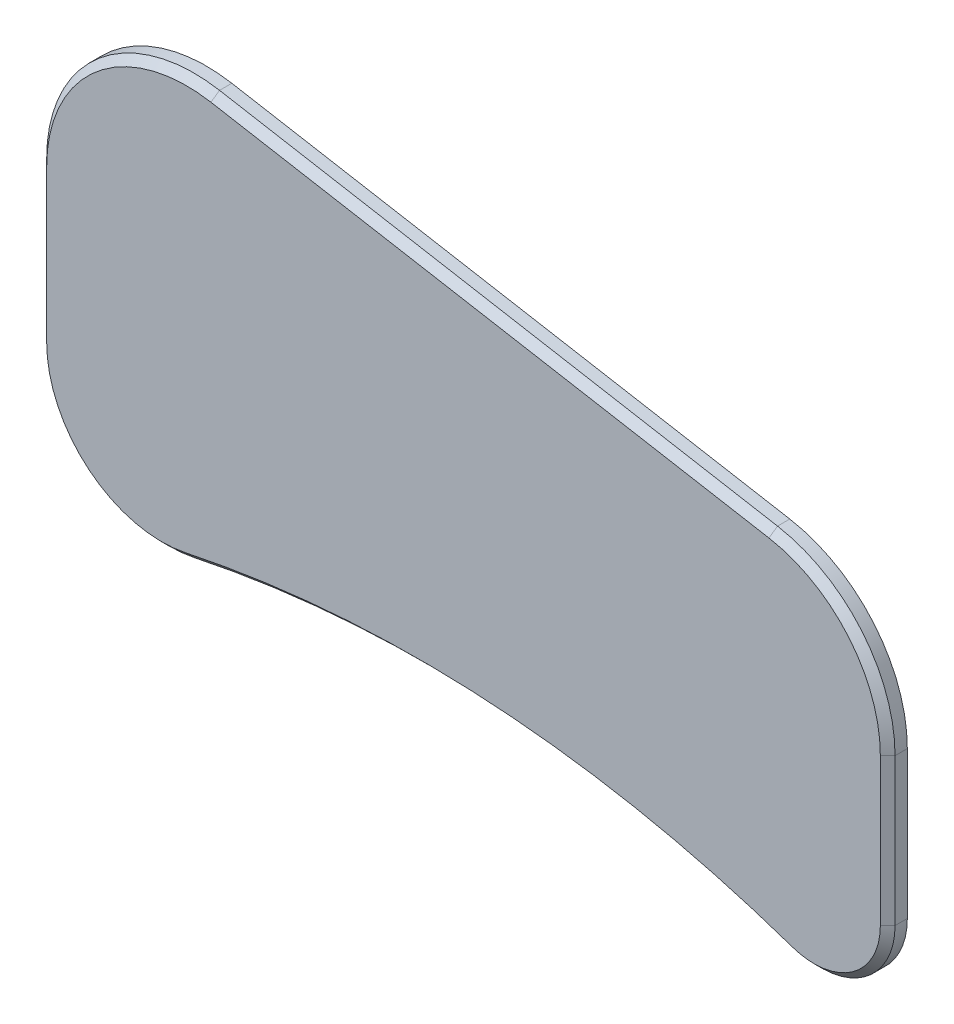
ISO-10303-21;
HEADER;
FILE_DESCRIPTION(('STEP AP214'),'2;1');
FILE_NAME('part.step','',(''),(''),'','','');
FILE_SCHEMA(('AUTOMOTIVE_DESIGN { 1 0 10303 214 1 1 1 1 }'));
ENDSEC;
DATA;
#1=APPLICATION_CONTEXT('core data for automotive mechanical design processes');
#2=APPLICATION_PROTOCOL_DEFINITION('international standard','automotive_design',2000,#1);
#3=PRODUCT_CONTEXT('',#1,'mechanical');
#4=PRODUCT('Part','Part','',(#3));
#5=PRODUCT_RELATED_PRODUCT_CATEGORY('part','',(#4));
#6=PRODUCT_DEFINITION_FORMATION('','',#4);
#7=PRODUCT_DEFINITION_CONTEXT('part definition',#1,'design');
#8=PRODUCT_DEFINITION('design','',#6,#7);
#9=PRODUCT_DEFINITION_SHAPE('','',#8);
#10=(LENGTH_UNIT() NAMED_UNIT(*) SI_UNIT(.MILLI.,.METRE.));
#11=(NAMED_UNIT(*) PLANE_ANGLE_UNIT() SI_UNIT($,.RADIAN.));
#12=(NAMED_UNIT(*) SI_UNIT($,.STERADIAN.) SOLID_ANGLE_UNIT());
#13=UNCERTAINTY_MEASURE_WITH_UNIT(LENGTH_MEASURE(1.E-05),#10,'distance_accuracy_value','');
#14=(GEOMETRIC_REPRESENTATION_CONTEXT(3) GLOBAL_UNCERTAINTY_ASSIGNED_CONTEXT((#13)) GLOBAL_UNIT_ASSIGNED_CONTEXT((#10,
#11,#12)) REPRESENTATION_CONTEXT('',''));
#15=CARTESIAN_POINT('',(0.,0.,0.));
#16=DIRECTION('',(0.,0.,1.));
#17=DIRECTION('',(1.,0.,0.));
#18=AXIS2_PLACEMENT_3D('',#15,#16,#17);
#19=CARTESIAN_POINT('',(-59.9643086686465,10.5216569582568,4.));
#20=DIRECTION('',(0.,0.,-1.));
#21=DIRECTION('',(-1.,0.,0.));
#22=AXIS2_PLACEMENT_3D('',#19,#20,#21);
#23=CYLINDRICAL_SURFACE('',#22,30.0356913313535);
#24=DIRECTION('',(0.,0.,-1.));
#25=VECTOR('',#24,1.);
#26=CARTESIAN_POINT('',(-90.,10.5216569582568,4.));
#27=LINE('',#26,#25);
#28=CARTESIAN_POINT('',(-90.,10.5216569582568,2.50000000000005));
#29=VERTEX_POINT('',#28);
#30=CARTESIAN_POINT('',(-90.,10.5216569582568,0.));
#31=VERTEX_POINT('',#30);
#32=EDGE_CURVE('E128',#29,#31,#27,.T.);
#33=ORIENTED_EDGE('',*,*,#32,.F.);
#34=CARTESIAN_POINT('',(-59.9643086686465,10.5216569582568,2.50000000000005));
#35=DIRECTION('',(0.,0.,-1.));
#36=DIRECTION('',(-1.,0.,0.));
#37=AXIS2_PLACEMENT_3D('',#34,#35,#36);
#38=CIRCLE('',#37,30.0356913313535);
#39=CARTESIAN_POINT('',(-54.7486656039907,40.1010386484553,2.50000000000005));
#40=VERTEX_POINT('',#39);
#41=EDGE_CURVE('E11',#29,#40,#38,.T.);
#42=ORIENTED_EDGE('',*,*,#41,.T.);
#43=DIRECTION('',(0.,0.,-1.));
#44=VECTOR('',#43,1.);
#45=CARTESIAN_POINT('',(-54.7486656039907,40.1010386484553,4.));
#46=LINE('',#45,#44);
#47=CARTESIAN_POINT('',(-54.7486656039907,40.1010386484553,0.));
#48=VERTEX_POINT('',#47);
#49=EDGE_CURVE('E147',#40,#48,#46,.T.);
#50=ORIENTED_EDGE('',*,*,#49,.T.);
#51=CARTESIAN_POINT('',(-59.9643086686465,10.5216569582568,0.));
#52=DIRECTION('',(0.,0.,1.));
#53=DIRECTION('',(-1.,0.,0.));
#54=AXIS2_PLACEMENT_3D('',#51,#52,#53);
#55=CIRCLE('',#54,30.0356913313535);
#56=EDGE_CURVE('E141',#48,#31,#55,.T.);
#57=ORIENTED_EDGE('',*,*,#56,.T.);
#58=EDGE_LOOP('',(#33,#42,#50,#57));
#59=FACE_BOUND('',#58,.T.);
#60=ADVANCED_FACE('F38',(#59),#23,.T.);
#61=CARTESIAN_POINT('',(-90.,-20.5216569582568,4.));
#62=DIRECTION('',(1.,0.,0.));
#63=DIRECTION('',(0.,1.,0.));
#64=AXIS2_PLACEMENT_3D('',#61,#62,#63);
#65=PLANE('',#64);
#66=DIRECTION('',(0.,0.,-1.));
#67=VECTOR('',#66,1.);
#68=CARTESIAN_POINT('',(-90.,-20.5216569582568,4.));
#69=LINE('',#68,#67);
#70=CARTESIAN_POINT('',(-90.,-20.5216569582568,2.50000000000005));
#71=VERTEX_POINT('',#70);
#72=CARTESIAN_POINT('',(-90.,-20.5216569582568,0.));
#73=VERTEX_POINT('',#72);
#74=EDGE_CURVE('E135',#71,#73,#69,.T.);
#75=ORIENTED_EDGE('',*,*,#74,.F.);
#76=DIRECTION('',(0.,1.,0.));
#77=VECTOR('',#76,1.);
#78=CARTESIAN_POINT('',(-90.,-20.5216569582568,2.50000000000005));
#79=LINE('',#78,#77);
#80=EDGE_CURVE('E47',#71,#29,#79,.T.);
#81=ORIENTED_EDGE('',*,*,#80,.T.);
#82=ORIENTED_EDGE('',*,*,#32,.T.);
#83=DIRECTION('',(0.,-1.,0.));
#84=VECTOR('',#83,1.);
#85=CARTESIAN_POINT('',(-90.,-20.5216569582568,0.));
#86=LINE('',#85,#84);
#87=EDGE_CURVE('E131',#31,#73,#86,.T.);
#88=ORIENTED_EDGE('',*,*,#87,.T.);
#89=EDGE_LOOP('',(#75,#81,#82,#88));
#90=FACE_BOUND('',#89,.T.);
#91=ADVANCED_FACE('F130',(#90),#65,.F.);
#92=CARTESIAN_POINT('',(-65.,-20.5216569582568,4.));
#93=DIRECTION('',(0.,0.,-1.));
#94=DIRECTION('',(-1.,0.,0.));
#95=AXIS2_PLACEMENT_3D('',#92,#93,#94);
#96=CYLINDRICAL_SURFACE('',#95,25.);
#97=DIRECTION('',(0.,0.,-1.));
#98=VECTOR('',#97,1.);
#99=CARTESIAN_POINT('',(-59.8284072240082,-44.9809011853238,4.));
#100=LINE('',#99,#98);
#101=CARTESIAN_POINT('',(-59.8284072240082,-44.9809011853238,2.50000000000005));
#102=VERTEX_POINT('',#101);
#103=CARTESIAN_POINT('',(-59.8284072240082,-44.9809011853238,0.));
#104=VERTEX_POINT('',#103);
#105=EDGE_CURVE('E182',#102,#104,#100,.T.);
#106=ORIENTED_EDGE('',*,*,#105,.F.);
#107=CARTESIAN_POINT('',(-65.,-20.5216569582568,2.50000000000005));
#108=DIRECTION('',(0.,0.,-1.));
#109=DIRECTION('',(-1.,0.,0.));
#110=AXIS2_PLACEMENT_3D('',#107,#108,#109);
#111=CIRCLE('',#110,25.);
#112=EDGE_CURVE('E217',#102,#71,#111,.T.);
#113=ORIENTED_EDGE('',*,*,#112,.T.);
#114=ORIENTED_EDGE('',*,*,#74,.T.);
#115=CARTESIAN_POINT('',(-65.,-20.5216569582568,0.));
#116=DIRECTION('',(0.,0.,1.));
#117=DIRECTION('',(1.,0.,0.));
#118=AXIS2_PLACEMENT_3D('',#115,#116,#117);
#119=CIRCLE('',#118,25.);
#120=EDGE_CURVE('E144',#73,#104,#119,.T.);
#121=ORIENTED_EDGE('',*,*,#120,.T.);
#122=EDGE_LOOP('',(#106,#113,#114,#121));
#123=FACE_BOUND('',#122,.T.);
#124=ADVANCED_FACE('F289',(#123),#96,.T.);
#125=CARTESIAN_POINT('',(-12.2497536848834,-270.00594807434,4.));
#126=DIRECTION('',(0.,0.,-1.));
#127=DIRECTION('',(-1.,0.,0.));
#128=AXIS2_PLACEMENT_3D('',#125,#126,#127);
#129=CYLINDRICAL_SURFACE('',#128,230.);
#130=DIRECTION('',(0.,0.,-1.));
#131=VECTOR('',#130,1.);
#132=CARTESIAN_POINT('',(63.0867497743949,-52.6941645776088,4.));
#133=LINE('',#132,#131);
#134=CARTESIAN_POINT('',(63.0867497743949,-52.6941645776088,2.50000000000005));
#135=VERTEX_POINT('',#134);
#136=CARTESIAN_POINT('',(63.0867497743949,-52.6941645776088,0.));
#137=VERTEX_POINT('',#136);
#138=EDGE_CURVE('E180',#135,#137,#133,.T.);
#139=ORIENTED_EDGE('',*,*,#138,.F.);
#140=CARTESIAN_POINT('',(-12.2497536848834,-270.00594807434,2.50000000000005));
#141=DIRECTION('',(0.,0.,-1.));
#142=DIRECTION('',(-1.,0.,0.));
#143=AXIS2_PLACEMENT_3D('',#140,#141,#142);
#144=CIRCLE('',#143,230.);
#145=EDGE_CURVE('E211',#135,#102,#144,.F.);
#146=ORIENTED_EDGE('',*,*,#145,.T.);
#147=ORIENTED_EDGE('',*,*,#105,.T.);
#148=CARTESIAN_POINT('',(-12.2497536848834,-270.00594807434,0.));
#149=DIRECTION('',(0.,0.,-1.));
#150=DIRECTION('',(1.,0.,0.));
#151=AXIS2_PLACEMENT_3D('',#148,#149,#150);
#152=CIRCLE('',#151,230.);
#153=EDGE_CURVE('E155',#104,#137,#152,.T.);
#154=ORIENTED_EDGE('',*,*,#153,.T.);
#155=EDGE_LOOP('',(#139,#146,#147,#154));
#156=FACE_BOUND('',#155,.T.);
#157=ADVANCED_FACE('F286',(#156),#129,.F.);
#158=CARTESIAN_POINT('',(68.,-38.5216569582568,4.));
#159=DIRECTION('',(0.,0.,-1.));
#160=DIRECTION('',(-1.,0.,0.));
#161=AXIS2_PLACEMENT_3D('',#158,#159,#160);
#162=CYLINDRICAL_SURFACE('',#161,15.);
#163=DIRECTION('',(0.,0.,-1.));
#164=VECTOR('',#163,1.);
#165=CARTESIAN_POINT('',(83.,-38.5216569582568,4.));
#166=LINE('',#165,#164);
#167=CARTESIAN_POINT('',(83.,-38.5216569582568,2.50000000000005));
#168=VERTEX_POINT('',#167);
#169=CARTESIAN_POINT('',(83.,-38.5216569582568,0.));
#170=VERTEX_POINT('',#169);
#171=EDGE_CURVE('E178',#168,#170,#166,.T.);
#172=ORIENTED_EDGE('',*,*,#171,.F.);
#173=CARTESIAN_POINT('',(68.,-38.5216569582568,2.50000000000005));
#174=DIRECTION('',(0.,0.,-1.));
#175=DIRECTION('',(-1.,0.,0.));
#176=AXIS2_PLACEMENT_3D('',#173,#174,#175);
#177=CIRCLE('',#176,15.);
#178=EDGE_CURVE('E206',#168,#135,#177,.T.);
#179=ORIENTED_EDGE('',*,*,#178,.T.);
#180=ORIENTED_EDGE('',*,*,#138,.T.);
#181=CARTESIAN_POINT('',(68.,-38.5216569582568,0.));
#182=DIRECTION('',(0.,0.,1.));
#183=DIRECTION('',(-1.,0.,0.));
#184=AXIS2_PLACEMENT_3D('',#181,#182,#183);
#185=CIRCLE('',#184,15.);
#186=EDGE_CURVE('E159',#137,#170,#185,.T.);
#187=ORIENTED_EDGE('',*,*,#186,.T.);
#188=EDGE_LOOP('',(#172,#179,#180,#187));
#189=FACE_BOUND('',#188,.T.);
#190=ADVANCED_FACE('F271',(#189),#162,.T.);
#191=CARTESIAN_POINT('',(83.,-8.52165695825678,4.));
#192=DIRECTION('',(-1.,0.,0.));
#193=DIRECTION('',(0.,0.,1.));
#194=AXIS2_PLACEMENT_3D('',#191,#192,#193);
#195=PLANE('',#194);
#196=DIRECTION('',(0.,0.,-1.));
#197=VECTOR('',#196,1.);
#198=CARTESIAN_POINT('',(83.,-8.52165695825678,4.));
#199=LINE('',#198,#197);
#200=CARTESIAN_POINT('',(83.,-8.52165695825678,2.50000000000005));
#201=VERTEX_POINT('',#200);
#202=CARTESIAN_POINT('',(83.,-8.52165695825678,0.));
#203=VERTEX_POINT('',#202);
#204=EDGE_CURVE('E176',#201,#203,#199,.T.);
#205=ORIENTED_EDGE('',*,*,#204,.F.);
#206=DIRECTION('',(0.,-1.,0.));
#207=VECTOR('',#206,1.);
#208=CARTESIAN_POINT('',(83.,-8.52165695825678,2.50000000000005));
#209=LINE('',#208,#207);
#210=EDGE_CURVE('E209',#201,#168,#209,.T.);
#211=ORIENTED_EDGE('',*,*,#210,.T.);
#212=ORIENTED_EDGE('',*,*,#171,.T.);
#213=DIRECTION('',(0.,1.,0.));
#214=VECTOR('',#213,1.);
#215=CARTESIAN_POINT('',(83.,-8.52165695825678,0.));
#216=LINE('',#215,#214);
#217=EDGE_CURVE('E162',#170,#203,#216,.T.);
#218=ORIENTED_EDGE('',*,*,#217,.T.);
#219=EDGE_LOOP('',(#205,#211,#212,#218));
#220=FACE_BOUND('',#219,.T.);
#221=ADVANCED_FACE('F268',(#220),#195,.F.);
#222=CARTESIAN_POINT('',(54.,-8.52165695825679,4.));
#223=DIRECTION('',(0.,0.,-1.));
#224=DIRECTION('',(-1.,0.,0.));
#225=AXIS2_PLACEMENT_3D('',#222,#223,#224);
#226=CYLINDRICAL_SURFACE('',#225,29.);
#227=DIRECTION('',(0.,0.,-1.));
#228=VECTOR('',#227,1.);
#229=CARTESIAN_POINT('',(59.0357971523408,20.0377678790973,4.));
#230=LINE('',#229,#228);
#231=CARTESIAN_POINT('',(59.0357971523408,20.0377678790973,2.50000000000005));
#232=VERTEX_POINT('',#231);
#233=CARTESIAN_POINT('',(59.0357971523408,20.0377678790973,0.));
#234=VERTEX_POINT('',#233);
#235=EDGE_CURVE('E173',#232,#234,#230,.T.);
#236=ORIENTED_EDGE('',*,*,#235,.F.);
#237=CARTESIAN_POINT('',(54.,-8.52165695825679,2.50000000000005));
#238=DIRECTION('',(0.,0.,-1.));
#239=DIRECTION('',(-1.,0.,0.));
#240=AXIS2_PLACEMENT_3D('',#237,#238,#239);
#241=CIRCLE('',#240,29.);
#242=EDGE_CURVE('E214',#232,#201,#241,.T.);
#243=ORIENTED_EDGE('',*,*,#242,.T.);
#244=ORIENTED_EDGE('',*,*,#204,.T.);
#245=CARTESIAN_POINT('',(54.,-8.52165695825679,0.));
#246=DIRECTION('',(0.,0.,1.));
#247=DIRECTION('',(1.,0.,0.));
#248=AXIS2_PLACEMENT_3D('',#245,#246,#247);
#249=CIRCLE('',#248,29.);
#250=EDGE_CURVE('E165',#203,#234,#249,.T.);
#251=ORIENTED_EDGE('',*,*,#250,.T.);
#252=EDGE_LOOP('',(#236,#243,#244,#251));
#253=FACE_BOUND('',#252,.T.);
#254=ADVANCED_FACE('F391',(#253),#226,.T.);
#255=CARTESIAN_POINT('',(-54.7486656039907,40.1010386484553,4.));
#256=DIRECTION('',(-0.173648177666925,-0.984807753012209,0.));
#257=DIRECTION('',(0.984807753012209,-0.173648177666925,0.));
#258=AXIS2_PLACEMENT_3D('',#255,#256,#257);
#259=PLANE('',#258);
#260=ORIENTED_EDGE('',*,*,#49,.F.);
#261=DIRECTION('',(0.984807753012209,-0.173648177666925,0.));
#262=VECTOR('',#261,1.);
#263=CARTESIAN_POINT('',(-54.7486656039907,40.1010386484553,2.50000000000005));
#264=LINE('',#263,#262);
#265=EDGE_CURVE('E220',#40,#232,#264,.T.);
#266=ORIENTED_EDGE('',*,*,#265,.T.);
#267=ORIENTED_EDGE('',*,*,#235,.T.);
#268=DIRECTION('',(-0.984807753012209,0.173648177666925,0.));
#269=VECTOR('',#268,1.);
#270=CARTESIAN_POINT('',(-54.7486656039907,40.1010386484553,0.));
#271=LINE('',#270,#269);
#272=EDGE_CURVE('E169',#234,#48,#271,.T.);
#273=ORIENTED_EDGE('',*,*,#272,.T.);
#274=EDGE_LOOP('',(#260,#266,#267,#273));
#275=FACE_BOUND('',#274,.T.);
#276=ADVANCED_FACE('F382',(#275),#259,.F.);
#277=CARTESIAN_POINT('',(-59.9643086686465,10.5216569582568,4.));
#278=DIRECTION('',(0.,0.,-1.));
#279=DIRECTION('',(-1.,0.,0.));
#280=AXIS2_PLACEMENT_3D('',#277,#278,#279);
#281=PLANE('',#280);
#282=CARTESIAN_POINT('',(-12.2497536848834,-270.00594807434,4.));
#283=DIRECTION('',(0.,0.,-1.));
#284=DIRECTION('',(-1.,0.,0.));
#285=AXIS2_PLACEMENT_3D('',#282,#283,#284);
#286=CIRCLE('',#285,231.5);
#287=CARTESIAN_POINT('',(-60.1387027905677,-43.5133465316998,4.));
#288=VERTEX_POINT('',#287);
#289=CARTESIAN_POINT('',(63.5780747969554,-51.2769138156737,4.));
#290=VERTEX_POINT('',#289);
#291=EDGE_CURVE('E198',#288,#290,#286,.T.);
#292=ORIENTED_EDGE('',*,*,#291,.T.);
#293=CARTESIAN_POINT('',(68.,-38.5216569582568,4.));
#294=DIRECTION('',(0.,0.,-1.));
#295=DIRECTION('',(-1.,0.,0.));
#296=AXIS2_PLACEMENT_3D('',#293,#294,#295);
#297=CIRCLE('',#296,13.5);
#298=CARTESIAN_POINT('',(81.5,-38.5216569582568,4.));
#299=VERTEX_POINT('',#298);
#300=EDGE_CURVE('E203',#290,#299,#297,.F.);
#301=ORIENTED_EDGE('',*,*,#300,.T.);
#302=DIRECTION('',(0.,1.,0.));
#303=VECTOR('',#302,1.);
#304=CARTESIAN_POINT('',(81.5,10.5216569582568,4.));
#305=LINE('',#304,#303);
#306=CARTESIAN_POINT('',(81.5,-8.52165695825678,4.));
#307=VERTEX_POINT('',#306);
#308=EDGE_CURVE('E201',#299,#307,#305,.T.);
#309=ORIENTED_EDGE('',*,*,#308,.T.);
#310=CARTESIAN_POINT('',(54.,-8.52165695825679,4.));
#311=DIRECTION('',(0.,0.,-1.));
#312=DIRECTION('',(-1.,0.,0.));
#313=AXIS2_PLACEMENT_3D('',#310,#311,#312);
#314=CIRCLE('',#313,27.5);
#315=CARTESIAN_POINT('',(58.7753248858404,18.560556249579,4.));
#316=VERTEX_POINT('',#315);
#317=EDGE_CURVE('E195',#307,#316,#314,.F.);
#318=ORIENTED_EDGE('',*,*,#317,.T.);
#319=DIRECTION('',(-0.984807753012209,0.173648177666925,0.));
#320=VECTOR('',#319,1.);
#321=CARTESIAN_POINT('',(-55.0091378704911,38.6238270189371,4.));
#322=LINE('',#321,#320);
#323=CARTESIAN_POINT('',(-55.0091378704911,38.623827018937,4.));
#324=VERTEX_POINT('',#323);
#325=EDGE_CURVE('E189',#316,#324,#322,.T.);
#326=ORIENTED_EDGE('',*,*,#325,.T.);
#327=CARTESIAN_POINT('',(-59.9643086686465,10.5216569582568,4.));
#328=DIRECTION('',(0.,0.,-1.));
#329=DIRECTION('',(-1.,0.,0.));
#330=AXIS2_PLACEMENT_3D('',#327,#328,#329);
#331=CIRCLE('',#330,28.5356913313535);
#332=CARTESIAN_POINT('',(-88.5,10.5216569582568,4.));
#333=VERTEX_POINT('',#332);
#334=EDGE_CURVE('E134',#324,#333,#331,.F.);
#335=ORIENTED_EDGE('',*,*,#334,.T.);
#336=DIRECTION('',(0.,-1.,0.));
#337=VECTOR('',#336,1.);
#338=CARTESIAN_POINT('',(-88.5000000000001,10.5216569582568,4.));
#339=LINE('',#338,#337);
#340=CARTESIAN_POINT('',(-88.5,-20.5216569582568,4.));
#341=VERTEX_POINT('',#340);
#342=EDGE_CURVE('E186',#333,#341,#339,.T.);
#343=ORIENTED_EDGE('',*,*,#342,.T.);
#344=CARTESIAN_POINT('',(-65.,-20.5216569582568,4.));
#345=DIRECTION('',(0.,0.,-1.));
#346=DIRECTION('',(-1.,0.,0.));
#347=AXIS2_PLACEMENT_3D('',#344,#345,#346);
#348=CIRCLE('',#347,23.5000000000001);
#349=EDGE_CURVE('E192',#341,#288,#348,.F.);
#350=ORIENTED_EDGE('',*,*,#349,.T.);
#351=EDGE_LOOP('',(#292,#301,#309,#318,#326,#335,#343,#350));
#352=FACE_BOUND('',#351,.T.);
#353=ADVANCED_FACE('F253',(#352),#281,.F.);
#354=CARTESIAN_POINT('',(-59.9643086686465,10.5216569582568,0.));
#355=DIRECTION('',(0.,0.,-1.));
#356=DIRECTION('',(-1.,0.,0.));
#357=AXIS2_PLACEMENT_3D('',#354,#355,#356);
#358=PLANE('',#357);
#359=ORIENTED_EDGE('',*,*,#56,.F.);
#360=ORIENTED_EDGE('',*,*,#272,.F.);
#361=ORIENTED_EDGE('',*,*,#250,.F.);
#362=ORIENTED_EDGE('',*,*,#217,.F.);
#363=ORIENTED_EDGE('',*,*,#186,.F.);
#364=ORIENTED_EDGE('',*,*,#153,.F.);
#365=ORIENTED_EDGE('',*,*,#120,.F.);
#366=ORIENTED_EDGE('',*,*,#87,.F.);
#367=EDGE_LOOP('',(#359,#360,#361,#362,#363,#364,#365,#366));
#368=FACE_BOUND('',#367,.T.);
#369=ADVANCED_FACE('F139',(#368),#358,.T.);
#370=CARTESIAN_POINT('',(-59.9643086686465,10.5216569582568,4.));
#371=DIRECTION('',(0.,0.,-1.));
#372=DIRECTION('',(-1.,0.,0.));
#373=AXIS2_PLACEMENT_3D('',#370,#371,#372);
#374=CONICAL_SURFACE('',#373,28.5356913313535,0.785398163397453);
#375=DIRECTION('',(-0.122787803968969,-0.696364240320025,0.707106781186542));
#376=VECTOR('',#375,1.);
#377=CARTESIAN_POINT('',(-54.7486656039907,40.1010386484553,2.50000000000005));
#378=LINE('',#377,#376);
#379=EDGE_CURVE('E151',#40,#324,#378,.T.);
#380=ORIENTED_EDGE('',*,*,#379,.F.);
#381=ORIENTED_EDGE('',*,*,#41,.F.);
#382=DIRECTION('',(-0.707106781186552,0.,-0.707106781186543));
#383=VECTOR('',#382,1.);
#384=CARTESIAN_POINT('',(-88.5,10.5216569582568,4.));
#385=LINE('',#384,#383);
#386=EDGE_CURVE('E42',#333,#29,#385,.T.);
#387=ORIENTED_EDGE('',*,*,#386,.F.);
#388=ORIENTED_EDGE('',*,*,#334,.F.);
#389=EDGE_LOOP('',(#380,#381,#387,#388));
#390=FACE_BOUND('',#389,.T.);
#391=ADVANCED_FACE('F40',(#390),#374,.T.);
#392=CARTESIAN_POINT('',(-88.5000000000001,10.5216569582568,4.));
#393=DIRECTION('',(0.707106781186546,0.,-0.707106781186549));
#394=DIRECTION('',(0.,-1.,0.));
#395=AXIS2_PLACEMENT_3D('',#392,#393,#394);
#396=PLANE('',#395);
#397=ORIENTED_EDGE('',*,*,#386,.T.);
#398=ORIENTED_EDGE('',*,*,#80,.F.);
#399=DIRECTION('',(-0.707106781186549,0.,-0.707106781186546));
#400=VECTOR('',#399,1.);
#401=CARTESIAN_POINT('',(-88.5,-20.5216569582568,4.));
#402=LINE('',#401,#400);
#403=EDGE_CURVE('E239',#341,#71,#402,.T.);
#404=ORIENTED_EDGE('',*,*,#403,.F.);
#405=ORIENTED_EDGE('',*,*,#342,.F.);
#406=EDGE_LOOP('',(#397,#398,#404,#405));
#407=FACE_BOUND('',#406,.T.);
#408=ADVANCED_FACE('F294',(#407),#396,.F.);
#409=CARTESIAN_POINT('',(-55.0091378704911,38.6238270189371,4.));
#410=DIRECTION('',(-0.122787803968969,-0.696364240320017,-0.70710678118655));
#411=DIRECTION('',(-0.984807753012209,0.173648177666925,0.));
#412=AXIS2_PLACEMENT_3D('',#409,#410,#411);
#413=PLANE('',#412);
#414=ORIENTED_EDGE('',*,*,#379,.T.);
#415=ORIENTED_EDGE('',*,*,#325,.F.);
#416=DIRECTION('',(-0.12278780396897,-0.696364240320022,0.707106781186544));
#417=VECTOR('',#416,1.);
#418=CARTESIAN_POINT('',(59.0357971523408,20.0377678790973,2.50000000000005));
#419=LINE('',#418,#417);
#420=EDGE_CURVE('E235',#232,#316,#419,.T.);
#421=ORIENTED_EDGE('',*,*,#420,.F.);
#422=ORIENTED_EDGE('',*,*,#265,.F.);
#423=EDGE_LOOP('',(#414,#415,#421,#422));
#424=FACE_BOUND('',#423,.T.);
#425=ADVANCED_FACE('F246',(#424),#413,.F.);
#426=CARTESIAN_POINT('',(-65.,-20.5216569582568,4.));
#427=DIRECTION('',(0.,0.,-1.));
#428=DIRECTION('',(-1.,0.,0.));
#429=AXIS2_PLACEMENT_3D('',#426,#427,#428);
#430=CONICAL_SURFACE('',#429,23.5000000000001,0.785398163397451);
#431=ORIENTED_EDGE('',*,*,#403,.T.);
#432=ORIENTED_EDGE('',*,*,#112,.F.);
#433=DIRECTION('',(0.146274732857568,-0.691811898226282,-0.707106781186545));
#434=VECTOR('',#433,1.);
#435=CARTESIAN_POINT('',(-60.1387027905677,-43.5133465316998,4.));
#436=LINE('',#435,#434);
#437=EDGE_CURVE('E232',#288,#102,#436,.T.);
#438=ORIENTED_EDGE('',*,*,#437,.F.);
#439=ORIENTED_EDGE('',*,*,#349,.F.);
#440=EDGE_LOOP('',(#431,#432,#438,#439));
#441=FACE_BOUND('',#440,.T.);
#442=ADVANCED_FACE('F291',(#441),#430,.T.);
#443=CARTESIAN_POINT('',(54.,-8.52165695825679,4.));
#444=DIRECTION('',(0.,0.,-1.));
#445=DIRECTION('',(-1.,0.,0.));
#446=AXIS2_PLACEMENT_3D('',#443,#444,#445);
#447=CONICAL_SURFACE('',#446,27.5,0.785398163397451);
#448=ORIENTED_EDGE('',*,*,#420,.T.);
#449=ORIENTED_EDGE('',*,*,#317,.F.);
#450=DIRECTION('',(-0.707106781186549,0.,0.707106781186546));
#451=VECTOR('',#450,1.);
#452=CARTESIAN_POINT('',(83.,-8.52165695825678,2.50000000000005));
#453=LINE('',#452,#451);
#454=EDGE_CURVE('E229',#201,#307,#453,.T.);
#455=ORIENTED_EDGE('',*,*,#454,.F.);
#456=ORIENTED_EDGE('',*,*,#242,.F.);
#457=EDGE_LOOP('',(#448,#449,#455,#456));
#458=FACE_BOUND('',#457,.T.);
#459=ADVANCED_FACE('F259',(#458),#447,.T.);
#460=CARTESIAN_POINT('',(-12.2497536848834,-270.00594807434,4.));
#461=DIRECTION('',(0.,0.,1.));
#462=DIRECTION('',(1.,0.,0.));
#463=AXIS2_PLACEMENT_3D('',#460,#461,#462);
#464=CONICAL_SURFACE('',#463,231.5,0.785398163397446);
#465=ORIENTED_EDGE('',*,*,#437,.T.);
#466=ORIENTED_EDGE('',*,*,#145,.F.);
#467=DIRECTION('',(-0.23161283681278,-0.668098416270792,-0.707106781186545));
#468=VECTOR('',#467,1.);
#469=CARTESIAN_POINT('',(63.5780747969554,-51.2769138156737,4.));
#470=LINE('',#469,#468);
#471=EDGE_CURVE('E227',#290,#135,#470,.T.);
#472=ORIENTED_EDGE('',*,*,#471,.F.);
#473=ORIENTED_EDGE('',*,*,#291,.F.);
#474=EDGE_LOOP('',(#465,#466,#472,#473));
#475=FACE_BOUND('',#474,.T.);
#476=ADVANCED_FACE('F282',(#475),#464,.F.);
#477=CARTESIAN_POINT('',(81.5,10.5216569582568,4.));
#478=DIRECTION('',(-0.707106781186546,0.,-0.707106781186549));
#479=DIRECTION('',(0.,1.,0.));
#480=AXIS2_PLACEMENT_3D('',#477,#478,#479);
#481=PLANE('',#480);
#482=ORIENTED_EDGE('',*,*,#454,.T.);
#483=ORIENTED_EDGE('',*,*,#308,.F.);
#484=DIRECTION('',(-0.707106781186549,0.,0.707106781186546));
#485=VECTOR('',#484,1.);
#486=CARTESIAN_POINT('',(83.,-38.5216569582568,2.50000000000005));
#487=LINE('',#486,#485);
#488=EDGE_CURVE('E225',#168,#299,#487,.T.);
#489=ORIENTED_EDGE('',*,*,#488,.F.);
#490=ORIENTED_EDGE('',*,*,#210,.F.);
#491=EDGE_LOOP('',(#482,#483,#489,#490));
#492=FACE_BOUND('',#491,.T.);
#493=ADVANCED_FACE('F263',(#492),#481,.F.);
#494=CARTESIAN_POINT('',(68.,-38.5216569582568,4.));
#495=DIRECTION('',(0.,0.,-1.));
#496=DIRECTION('',(-1.,0.,0.));
#497=AXIS2_PLACEMENT_3D('',#494,#495,#496);
#498=CONICAL_SURFACE('',#497,13.5,0.785398163397453);
#499=ORIENTED_EDGE('',*,*,#471,.T.);
#500=ORIENTED_EDGE('',*,*,#178,.F.);
#501=ORIENTED_EDGE('',*,*,#488,.T.);
#502=ORIENTED_EDGE('',*,*,#300,.F.);
#503=EDGE_LOOP('',(#499,#500,#501,#502));
#504=FACE_BOUND('',#503,.T.);
#505=ADVANCED_FACE('F276',(#504),#498,.T.);
#506=CLOSED_SHELL('',(#60,#91,#124,#157,#190,#221,#254,#276,#353,#369,#391,#408,#425,#442,#459,
#476,#493,#505));
#507=MANIFOLD_SOLID_BREP('B2',#506);
#508=ADVANCED_BREP_SHAPE_REPRESENTATION('',(#18,#507),#14);
#509=SHAPE_DEFINITION_REPRESENTATION(#9,#508);
ENDSEC;
END-ISO-10303-21;
